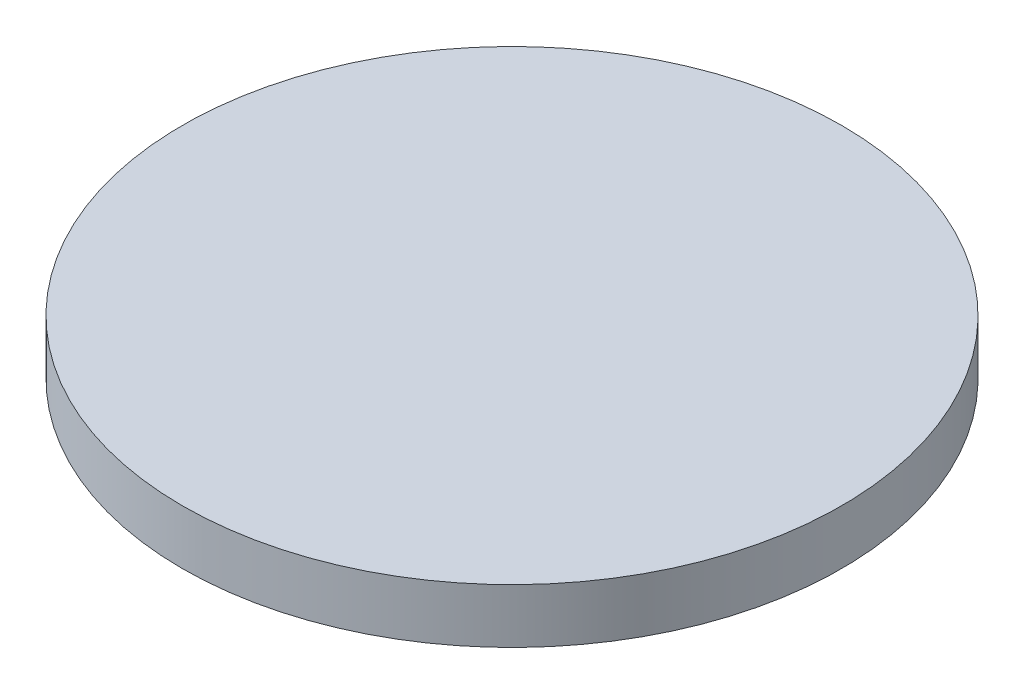
ISO-10303-21;
HEADER;
FILE_DESCRIPTION(('STEP AP214'),'2;1');
FILE_NAME('part.step','',(''),(''),'','','');
FILE_SCHEMA(('AUTOMOTIVE_DESIGN { 1 0 10303 214 1 1 1 1 }'));
ENDSEC;
DATA;
#1=APPLICATION_CONTEXT('core data for automotive mechanical design processes');
#2=APPLICATION_PROTOCOL_DEFINITION('international standard','automotive_design',2000,#1);
#3=PRODUCT_CONTEXT('',#1,'mechanical');
#4=PRODUCT('Part','Part','',(#3));
#5=PRODUCT_RELATED_PRODUCT_CATEGORY('part','',(#4));
#6=PRODUCT_DEFINITION_FORMATION('','',#4);
#7=PRODUCT_DEFINITION_CONTEXT('part definition',#1,'design');
#8=PRODUCT_DEFINITION('design','',#6,#7);
#9=PRODUCT_DEFINITION_SHAPE('','',#8);
#10=(LENGTH_UNIT() NAMED_UNIT(*) SI_UNIT(.MILLI.,.METRE.));
#11=(NAMED_UNIT(*) PLANE_ANGLE_UNIT() SI_UNIT($,.RADIAN.));
#12=(NAMED_UNIT(*) SI_UNIT($,.STERADIAN.) SOLID_ANGLE_UNIT());
#13=UNCERTAINTY_MEASURE_WITH_UNIT(LENGTH_MEASURE(1.E-05),#10,'distance_accuracy_value','');
#14=(GEOMETRIC_REPRESENTATION_CONTEXT(3) GLOBAL_UNCERTAINTY_ASSIGNED_CONTEXT((#13)) GLOBAL_UNIT_ASSIGNED_CONTEXT((#10,
#11,#12)) REPRESENTATION_CONTEXT('',''));
#15=CARTESIAN_POINT('',(0.,0.,0.));
#16=DIRECTION('',(0.,0.,1.));
#17=DIRECTION('',(1.,0.,0.));
#18=AXIS2_PLACEMENT_3D('',#15,#16,#17);
#19=CARTESIAN_POINT('',(0.,1.8,0.));
#20=DIRECTION('',(0.,-1.,0.));
#21=DIRECTION('',(0.,0.,-1.));
#22=AXIS2_PLACEMENT_3D('',#19,#20,#21);
#23=CYLINDRICAL_SURFACE('',#22,10.9);
#24=CARTESIAN_POINT('',(0.,1.8,0.));
#25=DIRECTION('',(0.,1.,0.));
#26=DIRECTION('',(0.,0.,1.));
#27=AXIS2_PLACEMENT_3D('',#24,#25,#26);
#28=CIRCLE('',#27,10.9);
#29=CARTESIAN_POINT('',(0.,1.8,10.9));
#30=VERTEX_POINT('',#29);
#31=EDGE_CURVE('E10',#30,#30,#28,.T.);
#32=ORIENTED_EDGE('',*,*,#31,.F.);
#33=EDGE_LOOP('',(#32));
#34=FACE_BOUND('',#33,.T.);
#35=CARTESIAN_POINT('',(0.,0.,0.));
#36=DIRECTION('',(0.,1.,0.));
#37=DIRECTION('',(0.,0.,1.));
#38=AXIS2_PLACEMENT_3D('',#35,#36,#37);
#39=CIRCLE('',#38,10.9);
#40=CARTESIAN_POINT('',(0.,0.,10.9));
#41=VERTEX_POINT('',#40);
#42=EDGE_CURVE('E40',#41,#41,#39,.T.);
#43=ORIENTED_EDGE('',*,*,#42,.T.);
#44=EDGE_LOOP('',(#43));
#45=FACE_BOUND('',#44,.T.);
#46=ADVANCED_FACE('F37',(#34,#45),#23,.T.);
#47=CARTESIAN_POINT('',(0.,1.8,0.));
#48=DIRECTION('',(0.,1.,0.));
#49=DIRECTION('',(0.,0.,1.));
#50=AXIS2_PLACEMENT_3D('',#47,#48,#49);
#51=PLANE('',#50);
#52=ORIENTED_EDGE('',*,*,#31,.T.);
#53=EDGE_LOOP('',(#52));
#54=FACE_BOUND('',#53,.T.);
#55=ADVANCED_FACE('F54',(#54),#51,.T.);
#56=CARTESIAN_POINT('',(0.,0.,0.));
#57=DIRECTION('',(0.,1.,0.));
#58=DIRECTION('',(0.,0.,1.));
#59=AXIS2_PLACEMENT_3D('',#56,#57,#58);
#60=PLANE('',#59);
#61=ORIENTED_EDGE('',*,*,#42,.F.);
#62=EDGE_LOOP('',(#61));
#63=FACE_BOUND('',#62,.T.);
#64=ADVANCED_FACE('F52',(#63),#60,.F.);
#65=CLOSED_SHELL('',(#46,#55,#64));
#66=MANIFOLD_SOLID_BREP('B2',#65);
#67=ADVANCED_BREP_SHAPE_REPRESENTATION('',(#18,#66),#14);
#68=SHAPE_DEFINITION_REPRESENTATION(#9,#67);
ENDSEC;
END-ISO-10303-21;
